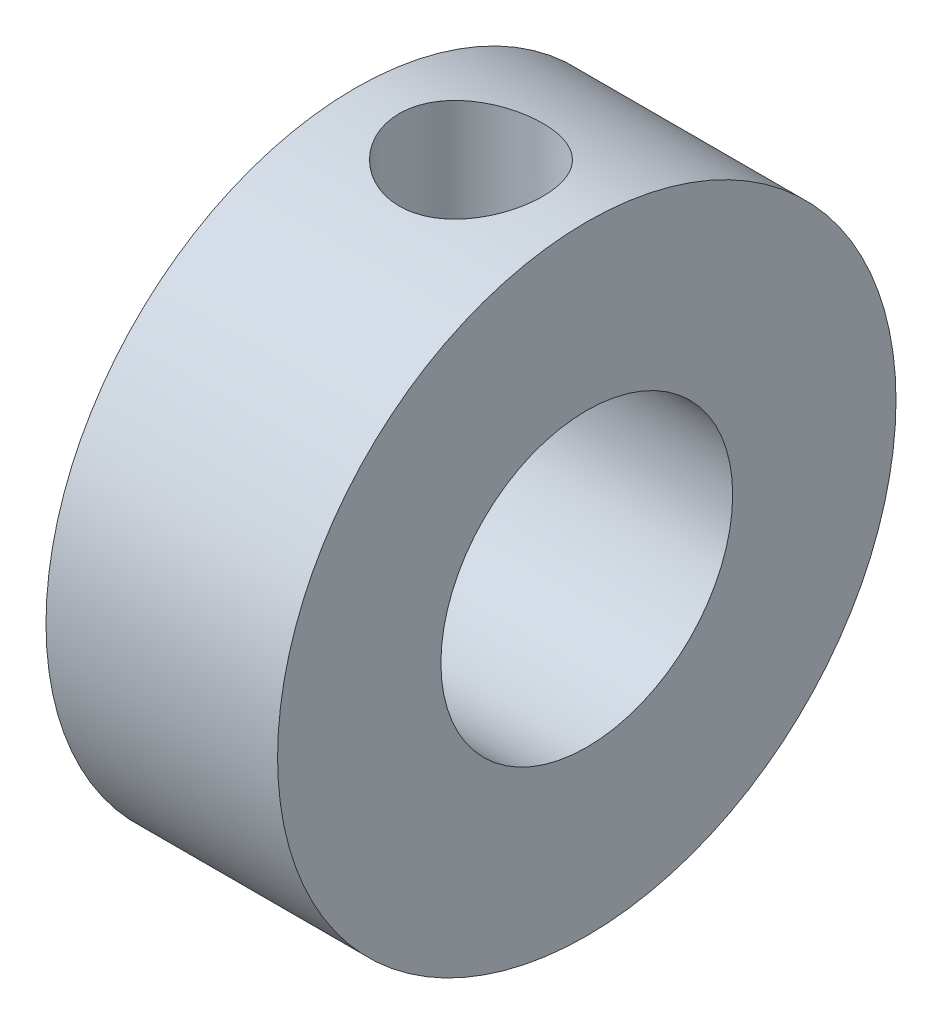
ISO-10303-21;
HEADER;
FILE_DESCRIPTION(('STEP AP214'),'2;1');
FILE_NAME('part.step','',(''),(''),'','','');
FILE_SCHEMA(('AUTOMOTIVE_DESIGN { 1 0 10303 214 1 1 1 1 }'));
ENDSEC;
DATA;
#1=APPLICATION_CONTEXT('core data for automotive mechanical design processes');
#2=APPLICATION_PROTOCOL_DEFINITION('international standard','automotive_design',2000,#1);
#3=PRODUCT_CONTEXT('',#1,'mechanical');
#4=PRODUCT('Part','Part','',(#3));
#5=PRODUCT_RELATED_PRODUCT_CATEGORY('part','',(#4));
#6=PRODUCT_DEFINITION_FORMATION('','',#4);
#7=PRODUCT_DEFINITION_CONTEXT('part definition',#1,'design');
#8=PRODUCT_DEFINITION('design','',#6,#7);
#9=PRODUCT_DEFINITION_SHAPE('','',#8);
#10=(LENGTH_UNIT() NAMED_UNIT(*) SI_UNIT(.MILLI.,.METRE.));
#11=(NAMED_UNIT(*) PLANE_ANGLE_UNIT() SI_UNIT($,.RADIAN.));
#12=(NAMED_UNIT(*) SI_UNIT($,.STERADIAN.) SOLID_ANGLE_UNIT());
#13=UNCERTAINTY_MEASURE_WITH_UNIT(LENGTH_MEASURE(1.E-05),#10,'distance_accuracy_value','');
#14=(GEOMETRIC_REPRESENTATION_CONTEXT(3) GLOBAL_UNCERTAINTY_ASSIGNED_CONTEXT((#13)) GLOBAL_UNIT_ASSIGNED_CONTEXT((#10,
#11,#12)) REPRESENTATION_CONTEXT('',''));
#15=CARTESIAN_POINT('',(0.,0.,0.));
#16=DIRECTION('',(0.,0.,1.));
#17=DIRECTION('',(1.,0.,0.));
#18=AXIS2_PLACEMENT_3D('',#15,#16,#17);
#19=CARTESIAN_POINT('',(0.,0.,0.));
#20=DIRECTION('',(-1.,0.,0.));
#21=DIRECTION('',(0.,0.,1.));
#22=AXIS2_PLACEMENT_3D('',#19,#20,#21);
#23=CYLINDRICAL_SURFACE('',#22,8.001);
#24=CARTESIAN_POINT('',(6.35,6.96534507400745,3.93700000000001));
#25=CARTESIAN_POINT('',(6.4528745950958,6.96534583031709,3.93699939109407));
#26=CARTESIAN_POINT('',(6.55576132480997,6.96763214874903,3.9329621398111));
#27=CARTESIAN_POINT('',(6.76074548033124,6.97669317154755,3.91686558861348));
#28=CARTESIAN_POINT('',(6.86284249865728,6.98347005460042,3.90480239474242));
#29=CARTESIAN_POINT('',(7.0655890651015,7.00127778350321,3.87278282861105));
#30=CARTESIAN_POINT('',(7.16623597714662,7.01231555822404,3.85281359854816));
#31=CARTESIAN_POINT('',(7.36521400164876,7.03824802506605,3.80523230037073));
#32=CARTESIAN_POINT('',(7.46354409158211,7.05314438662358,3.77761692375641));
#33=CARTESIAN_POINT('',(7.75299228425621,7.1027132943779,3.68408284412962));
#34=CARTESIAN_POINT('',(7.93985647483445,7.14238903037296,3.60726809257178));
#35=CARTESIAN_POINT('',(8.2979013857005,7.23049720279591,3.42722871425423));
#36=CARTESIAN_POINT('',(8.46908168846256,7.2789298722429,3.32400338468744));
#37=CARTESIAN_POINT('',(8.8060983283385,7.38382054941181,3.08441718271684));
#38=CARTESIAN_POINT('',(8.97042000616455,7.44061054085149,2.94607039257624));
#39=CARTESIAN_POINT('',(9.27475425432812,7.55315768309137,2.64418169360326));
#40=CARTESIAN_POINT('',(9.41475502006868,7.60891432067127,2.4806276222344));
#41=CARTESIAN_POINT('',(9.60800563878215,7.68940339963424,2.21326577631232));
#42=CARTESIAN_POINT('',(9.6712366207172,7.71646474779912,2.11722354303002));
#43=CARTESIAN_POINT('',(9.78930621160861,7.76801352536851,1.91947518554071));
#44=CARTESIAN_POINT('',(9.84414837199173,7.79250204260421,1.81777148314047));
#45=CARTESIAN_POINT('',(9.94491560118547,7.83820350831586,1.60933341586213));
#46=CARTESIAN_POINT('',(9.99084070944169,7.85941647128151,1.50259907324024));
#47=CARTESIAN_POINT('',(10.073237314902,7.89792382301572,1.28491430981461));
#48=CARTESIAN_POINT('',(10.1097140675198,7.91522038950599,1.17396627232509));
#49=CARTESIAN_POINT('',(10.1706035443868,7.94433002365216,0.956462204693522));
#50=CARTESIAN_POINT('',(10.1956739104861,7.95643861470096,0.850129629410488));
#51=CARTESIAN_POINT('',(10.2369222980051,7.9764572967297,0.635411309529445));
#52=CARTESIAN_POINT('',(10.2531046291536,7.98436942247417,0.52702658642091));
#53=CARTESIAN_POINT('',(10.2763779438818,7.99577217161584,0.30908264143396));
#54=CARTESIAN_POINT('',(10.2834713869572,7.99926399116558,0.199523745387629));
#55=CARTESIAN_POINT('',(10.288478393067,8.00172726997892,-0.0198499832964996));
#56=CARTESIAN_POINT('',(10.2863924947167,8.00069899446772,-0.129664800539731));
#57=CARTESIAN_POINT('',(10.2736328937154,7.99442922939904,-0.339337746760533));
#58=CARTESIAN_POINT('',(10.2637005128484,7.98955147075929,-0.439252380088345));
#59=CARTESIAN_POINT('',(10.2362883991126,7.97616038408474,-0.637803321326527));
#60=CARTESIAN_POINT('',(10.2188062289685,7.96764588202091,-0.736439205821734));
#61=CARTESIAN_POINT('',(10.155292433819,7.93692936274259,-1.0293341986357));
#62=CARTESIAN_POINT('',(10.0981810696312,7.90954784270354,-1.22077867598567));
#63=CARTESIAN_POINT('',(9.9556559742738,7.84300900830077,-1.59364257729762));
#64=CARTESIAN_POINT('',(9.86985295279299,7.80369044710555,-1.77488167242374));
#65=CARTESIAN_POINT('',(9.67288401247161,7.71685004533034,-2.12086303649826));
#66=CARTESIAN_POINT('',(9.56170892804185,7.66932524178118,-2.28559931282622));
#67=CARTESIAN_POINT('',(9.30533903498598,7.56538852827251,-2.61008526149251));
#68=CARTESIAN_POINT('',(9.15795131092035,7.50856121574128,-2.76797116157196));
#69=CARTESIAN_POINT('',(8.83928286175124,7.39529123490446,-3.05776366226357));
#70=CARTESIAN_POINT('',(8.66798490974154,7.33884887497983,-3.18965136487113));
#71=CARTESIAN_POINT('',(8.29352777047183,7.22907929801775,-3.43149188122207));
#72=CARTESIAN_POINT('',(8.08907315441427,7.17614255608649,-3.53965237764083));
#73=CARTESIAN_POINT('',(7.76878590730491,7.10760503382627,-3.67430004853826));
#74=CARTESIAN_POINT('',(7.65973131198808,7.0865671426344,-3.71458938822291));
#75=CARTESIAN_POINT('',(7.43780894557422,7.04893169026018,-3.78552239403874));
#76=CARTESIAN_POINT('',(7.32494353591812,7.03233143409485,-3.81617191645265));
#77=CARTESIAN_POINT('',(7.10523597658342,7.00538819107578,-3.8653928287024));
#78=CARTESIAN_POINT('',(6.99860959035969,6.99465848047328,-3.88471915024927));
#79=CARTESIAN_POINT('',(6.78380119762801,6.97801989957479,-3.91452843485311));
#80=CARTESIAN_POINT('',(6.67562001667896,6.97210856055716,-3.92501592663132));
#81=CARTESIAN_POINT('',(6.45863862136249,6.9653484730441,-3.93700006395041));
#82=CARTESIAN_POINT('',(6.34983862571701,6.96449803506001,-3.93849970991938));
#83=CARTESIAN_POINT('',(6.13257301272187,6.9678913042307,-3.93249332177486));
#84=CARTESIAN_POINT('',(6.02410737487941,6.97213469270047,-3.92498785104842));
#85=CARTESIAN_POINT('',(5.81976478184544,6.98483334024103,-3.90233928129895));
#86=CARTESIAN_POINT('',(5.72375848330423,6.99280126049183,-3.88807782791904));
#87=CARTESIAN_POINT('',(5.53340919396774,7.01240823818074,-3.85260114081026));
#88=CARTESIAN_POINT('',(5.43906676584411,7.0240485132849,-3.83138360051587));
#89=CARTESIAN_POINT('',(5.1594572789069,7.06395869848555,-3.75761422973844));
#90=CARTESIAN_POINT('',(4.97747012002161,7.09722733962404,-3.6949300118933));
#91=CARTESIAN_POINT('',(4.61820569083279,7.17515440815312,-3.54130749066465));
#92=CARTESIAN_POINT('',(4.44153929894227,7.22026989867107,-3.44919260544449));
#93=CARTESIAN_POINT('',(4.10513178997641,7.31638270866577,-3.2403316647802));
#94=CARTESIAN_POINT('',(3.94539938411667,7.36738302752661,-3.12357302352508));
#95=CARTESIAN_POINT('',(3.6271836809485,7.47695033231689,-2.85221554568782));
#96=CARTESIAN_POINT('',(3.47120217350311,7.53568474968997,-2.69474463913303));
#97=CARTESIAN_POINT('',(3.18706990775547,7.64873503682045,-2.35475035603614));
#98=CARTESIAN_POINT('',(3.05892762510881,7.70304955780088,-2.17221937747699));
#99=CARTESIAN_POINT('',(2.88926742355642,7.77753589690336,-1.88053121275282));
#100=CARTESIAN_POINT('',(2.83598187215092,7.80144020347087,-1.77900557278857));
#101=CARTESIAN_POINT('',(2.73824761698827,7.84594722638787,-1.57110944669227));
#102=CARTESIAN_POINT('',(2.69379495107069,7.86655142225735,-1.46474115926082));
#103=CARTESIAN_POINT('',(2.61423966095375,7.90384110044954,-1.24795560021833));
#104=CARTESIAN_POINT('',(2.57913279177648,7.92052836148436,-1.1375401928767));
#105=CARTESIAN_POINT('',(2.51868952481155,7.94948214672487,-0.913501120983283));
#106=CARTESIAN_POINT('',(2.49335201326375,7.96174917485081,-0.799877823734521));
#107=CARTESIAN_POINT('',(2.45462943742666,7.98058179310605,-0.580772056425332));
#108=CARTESIAN_POINT('',(2.44037321036601,7.98756146937857,-0.475478388457026));
#109=CARTESIAN_POINT('',(2.42041338259237,7.99735000491514,-0.263851821994821));
#110=CARTESIAN_POINT('',(2.41471263145216,8.00015747453908,-0.157518589116761));
#111=CARTESIAN_POINT('',(2.41195190363234,8.00151554256684,0.0552216210849008));
#112=CARTESIAN_POINT('',(2.41488610750121,8.00006900791964,0.161628500446393));
#113=CARTESIAN_POINT('',(2.42933457723344,7.99297312474651,0.373728730761448));
#114=CARTESIAN_POINT('',(2.4408519951801,7.98732223222138,0.479421805186389));
#115=CARTESIAN_POINT('',(2.48612513430115,7.96522635517352,0.780928324095021));
#116=CARTESIAN_POINT('',(2.53051653981501,7.94366509722197,0.974891486795577));
#117=CARTESIAN_POINT('',(2.64721759415438,7.8882208223521,1.35220805342242));
#118=CARTESIAN_POINT('',(2.71953136980902,7.85433598409456,1.53555988442257));
#119=CARTESIAN_POINT('',(2.8933407379191,7.77549122096505,1.89555741388328));
#120=CARTESIAN_POINT('',(2.99597121644146,7.73011282736003,2.07156215621293));
#121=CARTESIAN_POINT('',(3.22607001490269,7.63309249675511,2.40458867145141));
#122=CARTESIAN_POINT('',(3.3535497726364,7.58144767955174,2.56160164856341));
#123=CARTESIAN_POINT('',(3.64400889101329,7.47118684383854,2.86817020511728));
#124=CARTESIAN_POINT('',(3.80922914350638,7.41237967118773,3.0155359915975));
#125=CARTESIAN_POINT('',(4.16316729147266,7.29864896859966,3.28126005404309));
#126=CARTESIAN_POINT('',(4.35190467381354,7.24372871933915,3.39959402925555));
#127=CARTESIAN_POINT('',(4.65213495965036,7.16861300794019,3.55392577241263));
#128=CARTESIAN_POINT('',(4.75660166658212,7.14451113442314,3.60199261803218));
#129=CARTESIAN_POINT('',(4.96999580297292,7.09997027388109,3.68901234780728));
#130=CARTESIAN_POINT('',(5.07892090501519,7.07952940492086,3.72796991774083));
#131=CARTESIAN_POINT('',(5.30017598473564,7.04317285684812,3.79621009198303));
#132=CARTESIAN_POINT('',(5.41249632507267,7.02724549666498,3.82551770308446));
#133=CARTESIAN_POINT('',(5.63982027165747,7.00054793571189,3.87415861629943));
#134=CARTESIAN_POINT('',(5.7548219205911,6.98977408938125,3.89349896993509));
#135=CARTESIAN_POINT('',(5.95000489254904,6.97637032669397,3.91744505995292));
#136=CARTESIAN_POINT('',(6.02976198490115,6.97224477429952,3.92477190036306));
#137=CARTESIAN_POINT('',(6.18967691172472,6.96673176540048,3.93454976411921));
#138=CARTESIAN_POINT('',(6.26983477158839,6.9653444846517,3.93700047449115));
#139=CARTESIAN_POINT('',(6.35,6.96534507400745,3.93700000000001));
#140=B_SPLINE_CURVE_WITH_KNOTS('',3,(#24,#25,#26,#27,#28,#29,#30,#31,#32,#33,#34,#35,#36,#37,
#38,#39,#40,#41,#42,#43,#44,#45,#46,#47,#48,#49,#50,#51,#52,#53,#54,#55,#56,#57,#58,#59,#60,#61,
#62,#63,#64,#65,#66,#67,#68,#69,#70,#71,#72,#73,#74,#75,#76,#77,#78,#79,#80,#81,#82,#83,#84,#85,
#86,#87,#88,#89,#90,#91,#92,#93,#94,#95,#96,#97,#98,#99,#100,#101,#102,#103,#104,#105,#106,#107,
#108,#109,#110,#111,#112,#113,#114,#115,#116,#117,#118,#119,#120,#121,#122,#123,#124,#125,#126,
#127,#128,#129,#130,#131,#132,#133,#134,#135,#136,#137,#138,#139),.UNSPECIFIED.,.T.,.F.,(4,2,2,
2,2,2,2,2,2,2,2,2,2,2,2,2,2,2,2,2,2,2,2,2,2,2,2,2,2,2,2,2,2,2,2,2,2,2,2,2,2,2,2,2,2,2,2,2,2,2,2,
2,2,2,2,2,2,4),(0.,0.308540624604439,0.617231053509922,0.926425590042662,1.23575412519034,
1.85052895001308,2.46532013619835,3.12913641114158,3.79327398660735,4.14727560899171,
4.50112694670599,4.85497671908291,5.20862924658205,5.5379355564789,5.86708204740005,
6.19613945091174,6.52517754661131,6.82638400862712,7.12768778097922,7.72970721768851,
8.3402507971351,8.95101528390481,9.61815458546961,10.2857770545227,10.9934821201063,
11.3474851660256,11.7012727343831,12.0274983592893,12.3535567352875,12.6795062565893,
13.0054353865772,13.2972499892815,13.5891614526829,14.1725720562964,14.7830671850025,
15.393874857338,16.0787738040955,16.7638809771207,17.1148566950357,17.4656746188651,
17.8163329238647,18.1669512400733,18.4859818151574,18.8051186262066,19.1240404070918,
19.443079365959,20.040550129994,20.6381092319492,21.2617225494084,21.8856235885382,
22.5698633057481,23.2546738189416,23.6067438214923,23.9586323201425,24.3096016276195,
24.6603222932782,24.9007377448374,25.1411686269482),.UNSPECIFIED.);
#141=CARTESIAN_POINT('',(6.35,6.96534507400745,3.93700000000001));
#142=VERTEX_POINT('',#141);
#143=EDGE_CURVE('E58',#142,#142,#140,.T.);
#144=ORIENTED_EDGE('',*,*,#143,.T.);
#145=EDGE_LOOP('',(#144));
#146=FACE_BOUND('',#145,.T.);
#147=CARTESIAN_POINT('',(12.7,0.,0.));
#148=DIRECTION('',(-1.,0.,0.));
#149=DIRECTION('',(0.,0.,1.));
#150=AXIS2_PLACEMENT_3D('',#147,#148,#149);
#151=CIRCLE('',#150,8.001);
#152=CARTESIAN_POINT('',(12.7,0.,8.001));
#153=VERTEX_POINT('',#152);
#154=EDGE_CURVE('E55',#153,#153,#151,.T.);
#155=ORIENTED_EDGE('',*,*,#154,.F.);
#156=EDGE_LOOP('',(#155));
#157=FACE_BOUND('',#156,.T.);
#158=CARTESIAN_POINT('',(0.,0.,0.));
#159=DIRECTION('',(-1.,0.,0.));
#160=DIRECTION('',(0.,0.,1.));
#161=AXIS2_PLACEMENT_3D('',#158,#159,#160);
#162=CIRCLE('',#161,8.001);
#163=CARTESIAN_POINT('',(0.,0.,8.001));
#164=VERTEX_POINT('',#163);
#165=EDGE_CURVE('E42',#164,#164,#162,.T.);
#166=ORIENTED_EDGE('',*,*,#165,.T.);
#167=EDGE_LOOP('',(#166));
#168=FACE_BOUND('',#167,.T.);
#169=ADVANCED_FACE('F31',(#146,#157,#168),#23,.F.);
#170=CARTESIAN_POINT('',(0.,8.001,0.));
#171=DIRECTION('',(1.,0.,0.));
#172=DIRECTION('',(0.,0.,-1.));
#173=AXIS2_PLACEMENT_3D('',#170,#171,#172);
#174=PLANE('',#173);
#175=ORIENTED_EDGE('',*,*,#165,.F.);
#176=EDGE_LOOP('',(#175));
#177=FACE_BOUND('',#176,.T.);
#178=CARTESIAN_POINT('',(0.,0.,0.));
#179=DIRECTION('',(-1.,0.,0.));
#180=DIRECTION('',(0.,0.,1.));
#181=AXIS2_PLACEMENT_3D('',#178,#179,#180);
#182=CIRCLE('',#181,16.9581307707762);
#183=CARTESIAN_POINT('',(0.,0.,16.9581307707762));
#184=VERTEX_POINT('',#183);
#185=EDGE_CURVE('E46',#184,#184,#182,.T.);
#186=ORIENTED_EDGE('',*,*,#185,.T.);
#187=EDGE_LOOP('',(#186));
#188=FACE_BOUND('',#187,.T.);
#189=ADVANCED_FACE('F74',(#177,#188),#174,.F.);
#190=CARTESIAN_POINT('',(0.,0.,0.));
#191=DIRECTION('',(-1.,0.,0.));
#192=DIRECTION('',(0.,0.,1.));
#193=AXIS2_PLACEMENT_3D('',#190,#191,#192);
#194=CYLINDRICAL_SURFACE('',#193,16.9581307707762);
#195=CARTESIAN_POINT('',(6.35,16.4947940344446,3.93700000000001));
#196=CARTESIAN_POINT('',(6.13207868814379,16.4947983984063,3.93699300239533));
#197=CARTESIAN_POINT('',(5.91407615704278,16.4991597345711,3.91884480305821));
#198=CARTESIAN_POINT('',(5.48429578861854,16.5160966843958,3.84682583631838));
#199=CARTESIAN_POINT('',(5.27252218303002,16.5286777534645,3.7929313438615));
#200=CARTESIAN_POINT('',(4.86147841936936,16.5605542395232,3.65122899587354));
#201=CARTESIAN_POINT('',(4.66219386492167,16.5798417513548,3.56346105502652));
#202=CARTESIAN_POINT('',(4.28116610856205,16.6229482707196,3.35662071554582));
#203=CARTESIAN_POINT('',(4.09942301017611,16.6467673049944,3.23754813217414));
#204=CARTESIAN_POINT('',(3.75518196276652,16.6967592634765,2.96906419670916));
#205=CARTESIAN_POINT('',(3.593066223779,16.7229654727351,2.81916889601002));
#206=CARTESIAN_POINT('',(3.29603736819124,16.7744887294244,2.49433832013365));
#207=CARTESIAN_POINT('',(3.16112653672939,16.7998057020142,2.31940094359855));
#208=CARTESIAN_POINT('',(2.92080363727938,16.8470628919717,1.94686608910422));
#209=CARTESIAN_POINT('',(2.81576246928928,16.868959248354,1.74902329919776));
#210=CARTESIAN_POINT('',(2.64056515681645,16.906530539918,1.33789855662587));
#211=CARTESIAN_POINT('',(2.5704045915041,16.9222062634629,1.12461856442623));
#212=CARTESIAN_POINT('',(2.46817141687287,16.9453348095705,0.692652445551128));
#213=CARTESIAN_POINT('',(2.43545097951162,16.952927329972,0.474127247221842));
#214=CARTESIAN_POINT('',(2.40699807153788,16.959519173843,0.0345662635755673));
#215=CARTESIAN_POINT('',(2.41126085686278,16.9585195994728,-0.186469196102269));
#216=CARTESIAN_POINT('',(2.45617774574004,16.948145496903,-0.620299203092059));
#217=CARTESIAN_POINT('',(2.49613317936735,16.9389317646407,-0.833170503882868));
#218=CARTESIAN_POINT('',(2.61018382977855,16.9133494336472,-1.249101004642));
#219=CARTESIAN_POINT('',(2.68428071203895,16.8969804858748,-1.45215972540241));
#220=CARTESIAN_POINT('',(2.86510684746983,16.8586735481592,-1.84459941518853));
#221=CARTESIAN_POINT('',(2.97209417995216,16.8366917560467,-2.03385701696431));
#222=CARTESIAN_POINT('',(3.2154704969981,16.789558924212,-2.39198326119017));
#223=CARTESIAN_POINT('',(3.35186395439965,16.7644074025981,-2.56084879578859));
#224=CARTESIAN_POINT('',(3.65396096524487,16.7129960397703,-2.87755827427983));
#225=CARTESIAN_POINT('',(3.82027574931711,16.686724036019,-3.024817775785));
#226=CARTESIAN_POINT('',(4.17551405789685,16.6365788392259,-3.28947414509652));
#227=CARTESIAN_POINT('',(4.36443836267606,16.6127057290241,-3.40686998184789));
#228=CARTESIAN_POINT('',(4.76056045810774,16.5700240310333,-3.60877276515861));
#229=CARTESIAN_POINT('',(4.96782305797739,16.5512344416329,-3.69315684829372));
#230=CARTESIAN_POINT('',(5.39412951029731,16.5211012291732,-3.82571342683698));
#231=CARTESIAN_POINT('',(5.6131712212309,16.5097562575539,-3.87389248085724));
#232=CARTESIAN_POINT('',(6.05144465213717,16.4960752779187,-3.93173892797393));
#233=CARTESIAN_POINT('',(6.27055721665948,16.4935389667302,-3.94226274725149));
#234=CARTESIAN_POINT('',(6.70740629736766,16.4972201131877,-3.92682946760846));
#235=CARTESIAN_POINT('',(6.92514291981122,16.5034368863656,-3.90087522117658));
#236=CARTESIAN_POINT('',(7.34999616006582,16.5237333981666,-3.81396900177501));
#237=CARTESIAN_POINT('',(7.55721719725963,16.5377046050799,-3.75349977880382));
#238=CARTESIAN_POINT('',(7.95858490476736,16.5718357493359,-3.59980794798835));
#239=CARTESIAN_POINT('',(8.15273019382807,16.5919963392461,-3.50658188633064));
#240=CARTESIAN_POINT('',(8.52610952893693,16.6366671140432,-3.28817521587931));
#241=CARTESIAN_POINT('',(8.70503033425776,16.6612460343825,-3.16247345946616));
#242=CARTESIAN_POINT('',(9.03955322573675,16.7118081298062,-2.88335590545534));
#243=CARTESIAN_POINT('',(9.19515202452409,16.737791502155,-2.72993620756347));
#244=CARTESIAN_POINT('',(9.48199804389365,16.788902835286,-2.39583924707575));
#245=CARTESIAN_POINT('',(9.61265777286317,16.814000900771,-2.21465220190213));
#246=CARTESIAN_POINT('',(9.8416885784946,16.8599373245919,-1.83240615780216));
#247=CARTESIAN_POINT('',(9.94006125335798,16.8807758937526,-1.63134814312527));
#248=CARTESIAN_POINT('',(10.1009374307164,16.9157207114588,-1.21639074635118));
#249=CARTESIAN_POINT('',(10.1636830133508,16.9298722838928,-1.00258921021756));
#250=CARTESIAN_POINT('',(10.2522692662528,16.950045669825,-0.567110259397691));
#251=CARTESIAN_POINT('',(10.2781160214927,16.9560688237688,-0.345434149485541));
#252=CARTESIAN_POINT('',(10.2918685919103,16.9592607232004,0.0939490618454742));
#253=CARTESIAN_POINT('',(10.280647173221,16.9566331539449,0.311627813767474));
#254=CARTESIAN_POINT('',(10.2225535133344,16.9432615643426,0.741906734996748));
#255=CARTESIAN_POINT('',(10.1756820774301,16.9325177273329,0.954507018908895));
#256=CARTESIAN_POINT('',(10.0480587681693,16.9041428193977,1.3678194808667));
#257=CARTESIAN_POINT('',(9.9674449372512,16.8865398297735,1.5685763357326));
#258=CARTESIAN_POINT('',(9.77475470139811,16.8463150260516,1.95382345026724));
#259=CARTESIAN_POINT('',(9.66267484205488,16.8236926609734,2.13831192103399));
#260=CARTESIAN_POINT('',(9.40746440403545,16.7752893141047,2.48999473880618));
#261=CARTESIAN_POINT('',(9.26372877627581,16.7494517757962,2.6567422552163));
#262=CARTESIAN_POINT('',(8.95048870198036,16.697812916216,2.96404786772314));
#263=CARTESIAN_POINT('',(8.78097793728378,16.672011605394,3.10459952367561));
#264=CARTESIAN_POINT('',(8.4178391704858,16.6229169878796,3.35763942742149));
#265=CARTESIAN_POINT('',(8.2238782562248,16.5996687224448,3.46965923429726));
#266=CARTESIAN_POINT('',(7.81937560742772,16.5588937784296,3.65933296020757));
#267=CARTESIAN_POINT('',(7.60884726504934,16.5413625363257,3.73701430707325));
#268=CARTESIAN_POINT('',(7.22360920458272,16.5170434636671,3.84287893303567));
#269=CARTESIAN_POINT('',(7.05089454954193,16.5087582798681,3.87810294202354));
#270=CARTESIAN_POINT('',(6.70213746937274,16.4976319712106,3.92516557620924));
#271=CARTESIAN_POINT('',(6.52609525171353,16.4947905080665,3.93700565454086));
#272=CARTESIAN_POINT('',(6.35,16.4947940344446,3.93700000000001));
#273=B_SPLINE_CURVE_WITH_KNOTS('',3,(#195,#196,#197,#198,#199,#200,#201,#202,#203,#204,#205,
#206,#207,#208,#209,#210,#211,#212,#213,#214,#215,#216,#217,#218,#219,#220,#221,#222,#223,#224,
#225,#226,#227,#228,#229,#230,#231,#232,#233,#234,#235,#236,#237,#238,#239,#240,#241,#242,#243,
#244,#245,#246,#247,#248,#249,#250,#251,#252,#253,#254,#255,#256,#257,#258,#259,#260,#261,#262,
#263,#264,#265,#266,#267,#268,#269,#270,#271,#272),.UNSPECIFIED.,.T.,.F.,(4,2,2,2,2,2,2,2,2,2,2,
2,2,2,2,2,2,2,2,2,2,2,2,2,2,2,2,2,2,2,2,2,2,2,2,2,2,2,4),(0.,0.653118044755164,1.30667000268019,
1.95945418922302,2.61224222812586,3.27619228824979,3.94019809516713,4.61212099750517,
5.28395871741528,5.94398693819487,6.60393049439762,7.25123228748823,7.89856566037776,
8.55111398706454,9.20376164015727,9.87168289892089,10.5396272148047,11.2100343642808,
11.8803200388899,12.5352603307021,13.1901494107571,13.8360956752477,14.4821100674262,
15.1392158957834,15.7964142600537,16.4675729529555,17.1386984186498,17.8052073841391,
18.471606423174,19.1224280384534,19.773234952857,20.4214050001848,21.0696462328569,
21.7315598877438,22.3936360573398,23.0659680879819,23.7377621190009,24.2655587499914,
24.7933225813953),.UNSPECIFIED.);
#274=CARTESIAN_POINT('',(6.35,16.4947940344446,3.93700000000001));
#275=VERTEX_POINT('',#274);
#276=EDGE_CURVE('E10',#275,#275,#273,.T.);
#277=ORIENTED_EDGE('',*,*,#276,.T.);
#278=EDGE_LOOP('',(#277));
#279=FACE_BOUND('',#278,.T.);
#280=ORIENTED_EDGE('',*,*,#185,.F.);
#281=EDGE_LOOP('',(#280));
#282=FACE_BOUND('',#281,.T.);
#283=CARTESIAN_POINT('',(12.7,0.,0.));
#284=DIRECTION('',(-1.,0.,0.));
#285=DIRECTION('',(0.,0.,1.));
#286=AXIS2_PLACEMENT_3D('',#283,#284,#285);
#287=CIRCLE('',#286,16.9581307707762);
#288=CARTESIAN_POINT('',(12.7,0.,16.9581307707762));
#289=VERTEX_POINT('',#288);
#290=EDGE_CURVE('E50',#289,#289,#287,.T.);
#291=ORIENTED_EDGE('',*,*,#290,.T.);
#292=EDGE_LOOP('',(#291));
#293=FACE_BOUND('',#292,.T.);
#294=ADVANCED_FACE('F70',(#279,#282,#293),#194,.T.);
#295=CARTESIAN_POINT('',(12.7,16.9581307707762,0.));
#296=DIRECTION('',(-1.,0.,0.));
#297=DIRECTION('',(0.,0.,1.));
#298=AXIS2_PLACEMENT_3D('',#295,#296,#297);
#299=PLANE('',#298);
#300=ORIENTED_EDGE('',*,*,#290,.F.);
#301=EDGE_LOOP('',(#300));
#302=FACE_BOUND('',#301,.T.);
#303=ORIENTED_EDGE('',*,*,#154,.T.);
#304=EDGE_LOOP('',(#303));
#305=FACE_BOUND('',#304,.T.);
#306=ADVANCED_FACE('F66',(#302,#305),#299,.F.);
#307=CARTESIAN_POINT('',(6.35,16.9581307707762,0.));
#308=DIRECTION('',(0.,1.,0.));
#309=DIRECTION('',(0.,0.,1.));
#310=AXIS2_PLACEMENT_3D('',#307,#308,#309);
#311=CYLINDRICAL_SURFACE('',#310,3.93700000000001);
#312=ORIENTED_EDGE('',*,*,#276,.F.);
#313=EDGE_LOOP('',(#312));
#314=FACE_BOUND('',#313,.T.);
#315=ORIENTED_EDGE('',*,*,#143,.F.);
#316=EDGE_LOOP('',(#315));
#317=FACE_BOUND('',#316,.T.);
#318=ADVANCED_FACE('F62',(#314,#317),#311,.F.);
#319=CLOSED_SHELL('',(#169,#189,#294,#306,#318));
#320=MANIFOLD_SOLID_BREP('B2',#319);
#321=ADVANCED_BREP_SHAPE_REPRESENTATION('',(#18,#320),#14);
#322=SHAPE_DEFINITION_REPRESENTATION(#9,#321);
ENDSEC;
END-ISO-10303-21;
